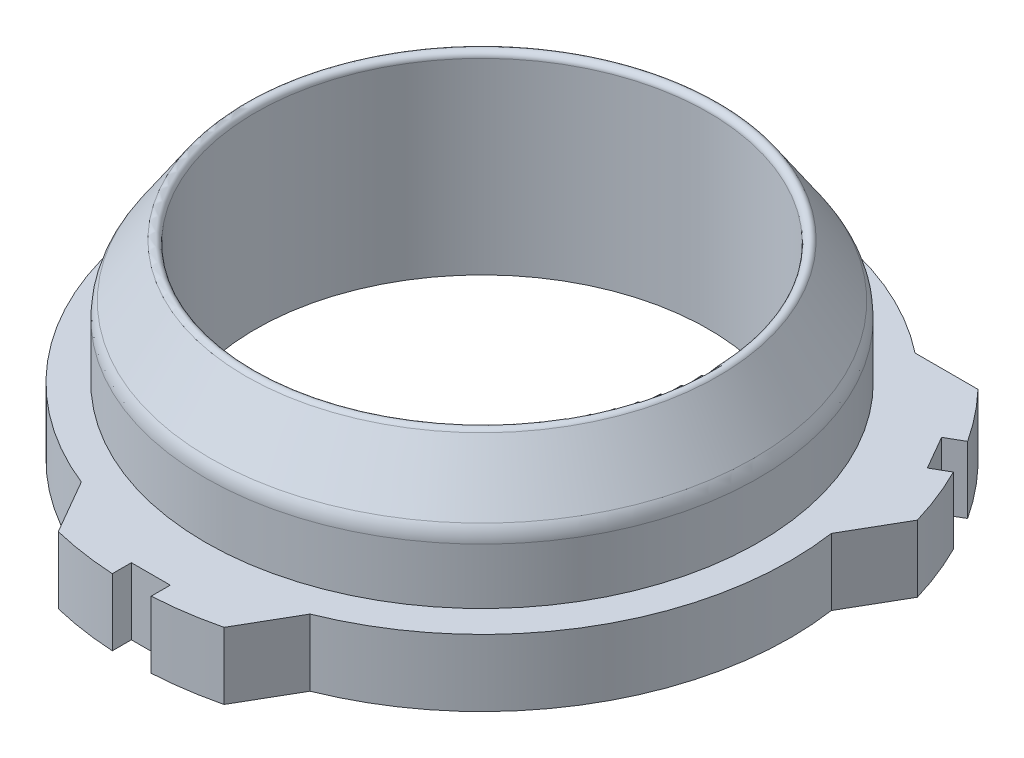
ISO-10303-21;
HEADER;
FILE_DESCRIPTION(('STEP AP214'),'2;1');
FILE_NAME('part.step','',(''),(''),'','','');
FILE_SCHEMA(('AUTOMOTIVE_DESIGN { 1 0 10303 214 1 1 1 1 }'));
ENDSEC;
DATA;
#1=APPLICATION_CONTEXT('core data for automotive mechanical design processes');
#2=APPLICATION_PROTOCOL_DEFINITION('international standard','automotive_design',2000,#1);
#3=PRODUCT_CONTEXT('',#1,'mechanical');
#4=PRODUCT('Part','Part','',(#3));
#5=PRODUCT_RELATED_PRODUCT_CATEGORY('part','',(#4));
#6=PRODUCT_DEFINITION_FORMATION('','',#4);
#7=PRODUCT_DEFINITION_CONTEXT('part definition',#1,'design');
#8=PRODUCT_DEFINITION('design','',#6,#7);
#9=PRODUCT_DEFINITION_SHAPE('','',#8);
#10=(LENGTH_UNIT() NAMED_UNIT(*) SI_UNIT(.MILLI.,.METRE.));
#11=(NAMED_UNIT(*) PLANE_ANGLE_UNIT() SI_UNIT($,.RADIAN.));
#12=(NAMED_UNIT(*) SI_UNIT($,.STERADIAN.) SOLID_ANGLE_UNIT());
#13=UNCERTAINTY_MEASURE_WITH_UNIT(LENGTH_MEASURE(1.E-05),#10,'distance_accuracy_value','');
#14=(GEOMETRIC_REPRESENTATION_CONTEXT(3) GLOBAL_UNCERTAINTY_ASSIGNED_CONTEXT((#13)) GLOBAL_UNIT_ASSIGNED_CONTEXT((#10,
#11,#12)) REPRESENTATION_CONTEXT('',''));
#15=CARTESIAN_POINT('',(0.,0.,0.));
#16=DIRECTION('',(0.,0.,1.));
#17=DIRECTION('',(1.,0.,0.));
#18=AXIS2_PLACEMENT_3D('',#15,#16,#17);
#19=CARTESIAN_POINT('',(0.,6.35,0.));
#20=DIRECTION('',(0.,1.,0.));
#21=DIRECTION('',(0.,0.,1.));
#22=AXIS2_PLACEMENT_3D('',#19,#20,#21);
#23=PLANE('',#22);
#24=CARTESIAN_POINT('',(0.,6.35,0.));
#25=DIRECTION('',(0.,1.,0.));
#26=DIRECTION('',(0.,0.,1.));
#27=AXIS2_PLACEMENT_3D('',#24,#25,#26);
#28=CIRCLE('',#27,26.289);
#29=CARTESIAN_POINT('',(0.,6.35,26.289));
#30=VERTEX_POINT('',#29);
#31=EDGE_CURVE('E348',#30,#30,#28,.T.);
#32=ORIENTED_EDGE('',*,*,#31,.F.);
#33=EDGE_LOOP('',(#32));
#34=FACE_BOUND('',#33,.T.);
#35=DIRECTION('',(0.499999999999993,0.,0.866025403784443));
#36=VECTOR('',#35,1.);
#37=CARTESIAN_POINT('',(28.1834671998819,6.35,-14.136703058055));
#38=LINE('',#37,#36);
#39=CARTESIAN_POINT('',(26.334477573974,6.35,-17.3392470327953));
#40=VERTEX_POINT('',#39);
#41=CARTESIAN_POINT('',(28.1834671998819,6.35,-14.136703058055));
#42=VERTEX_POINT('',#41);
#43=EDGE_CURVE('E208',#40,#42,#38,.T.);
#44=ORIENTED_EDGE('',*,*,#43,.F.);
#45=DIRECTION('',(-0.866025403784443,0.,0.499999999999992));
#46=VECTOR('',#45,1.);
#47=CARTESIAN_POINT('',(26.334477573974,6.35,-17.3392470327953));
#48=LINE('',#47,#46);
#49=CARTESIAN_POINT('',(27.9021874052614,6.35,-18.2443647259002));
#50=VERTEX_POINT('',#49);
#51=EDGE_CURVE('E199',#50,#40,#48,.T.);
#52=ORIENTED_EDGE('',*,*,#51,.F.);
#53=CARTESIAN_POINT('',(0.,6.35,0.));
#54=DIRECTION('',(0.,1.,0.));
#55=DIRECTION('',(0.,0.,1.));
#56=AXIS2_PLACEMENT_3D('',#53,#54,#55);
#57=CIRCLE('',#56,33.3375);
#58=CARTESIAN_POINT('',(24.1148513304045,6.35,-23.0187499999997));
#59=VERTEX_POINT('',#58);
#60=EDGE_CURVE('E372',#50,#59,#57,.T.);
#61=ORIENTED_EDGE('',*,*,#60,.T.);
#62=DIRECTION('',(-1.,0.,0.));
#63=VECTOR('',#62,1.);
#64=CARTESIAN_POINT('',(18.1345461975263,6.35,-23.0187499999997));
#65=LINE('',#64,#63);
#66=CARTESIAN_POINT('',(18.1345461975263,6.35,-23.0187499999997));
#67=VERTEX_POINT('',#66);
#68=EDGE_CURVE('E287',#59,#67,#65,.T.);
#69=ORIENTED_EDGE('',*,*,#68,.T.);
#70=CARTESIAN_POINT('',(0.,6.35,0.));
#71=DIRECTION('',(0.,1.,0.));
#72=DIRECTION('',(0.,0.,-1.));
#73=AXIS2_PLACEMENT_3D('',#70,#71,#72);
#74=CIRCLE('',#73,29.3040034355837);
#75=CARTESIAN_POINT('',(-18.1345461975263,6.35,-23.0187499999997));
#76=VERTEX_POINT('',#75);
#77=EDGE_CURVE('E290',#67,#76,#74,.T.);
#78=ORIENTED_EDGE('',*,*,#77,.T.);
#79=DIRECTION('',(-1.,0.,0.));
#80=VECTOR('',#79,1.);
#81=CARTESIAN_POINT('',(-24.1148513304039,6.35,-23.0187499999997));
#82=LINE('',#81,#80);
#83=CARTESIAN_POINT('',(-24.1148513304039,6.35,-23.0187499999997));
#84=VERTEX_POINT('',#83);
#85=EDGE_CURVE('E293',#76,#84,#82,.T.);
#86=ORIENTED_EDGE('',*,*,#85,.T.);
#87=CARTESIAN_POINT('',(-27.9021874052611,6.35,-18.2443647259006));
#88=VERTEX_POINT('',#87);
#89=EDGE_CURVE('E396',#84,#88,#57,.T.);
#90=ORIENTED_EDGE('',*,*,#89,.T.);
#91=DIRECTION('',(-0.866025403784436,0.,-0.500000000000005));
#92=VECTOR('',#91,1.);
#93=CARTESIAN_POINT('',(-26.3344775739738,6.35,-17.3392470327956));
#94=LINE('',#93,#92);
#95=CARTESIAN_POINT('',(-26.3344775739738,6.35,-17.3392470327956));
#96=VERTEX_POINT('',#95);
#97=EDGE_CURVE('E61',#96,#88,#94,.T.);
#98=ORIENTED_EDGE('',*,*,#97,.F.);
#99=DIRECTION('',(0.500000000000004,0.,-0.866025403784436));
#100=VECTOR('',#99,1.);
#101=CARTESIAN_POINT('',(-26.3344775739738,6.35,-17.3392470327956));
#102=LINE('',#101,#100);
#103=CARTESIAN_POINT('',(-28.1834671998817,6.35,-14.1367030580553));
#104=VERTEX_POINT('',#103);
#105=EDGE_CURVE('E231',#104,#96,#102,.T.);
#106=ORIENTED_EDGE('',*,*,#105,.F.);
#107=DIRECTION('',(0.866025403784436,0.,0.500000000000004));
#108=VECTOR('',#107,1.);
#109=CARTESIAN_POINT('',(-28.1834671998817,6.35,-14.1367030580553));
#110=LINE('',#109,#108);
#111=CARTESIAN_POINT('',(-29.7511770311691,6.35,-15.0418207511603));
#112=VERTEX_POINT('',#111);
#113=EDGE_CURVE('E229',#112,#104,#110,.T.);
#114=ORIENTED_EDGE('',*,*,#113,.F.);
#115=CARTESIAN_POINT('',(-31.992247928565,6.35,-9.37469886061421));
#116=VERTEX_POINT('',#115);
#117=EDGE_CURVE('E370',#112,#116,#57,.T.);
#118=ORIENTED_EDGE('',*,*,#117,.T.);
#119=DIRECTION('',(0.500000000000004,0.,0.866025403784436));
#120=VECTOR('',#119,1.);
#121=CARTESIAN_POINT('',(-29.0020953621261,6.35,-4.19560269315963));
#122=LINE('',#121,#120);
#123=CARTESIAN_POINT('',(-29.0020953621261,6.35,-4.19560269315963));
#124=VERTEX_POINT('',#123);
#125=EDGE_CURVE('E268',#116,#124,#122,.T.);
#126=ORIENTED_EDGE('',*,*,#125,.T.);
#127=CARTESIAN_POINT('',(0.,6.35,0.));
#128=DIRECTION('',(0.,1.,0.));
#129=DIRECTION('',(0.,0.,-1.));
#130=AXIS2_PLACEMENT_3D('',#127,#128,#129);
#131=CIRCLE('',#130,29.3040034355837);
#132=CARTESIAN_POINT('',(-10.8675491646001,6.35,27.2143526931599));
#133=VERTEX_POINT('',#132);
#134=EDGE_CURVE('E271',#124,#133,#131,.T.);
#135=ORIENTED_EDGE('',*,*,#134,.T.);
#136=DIRECTION('',(0.500000000000004,0.,0.866025403784436));
#137=VECTOR('',#136,1.);
#138=CARTESIAN_POINT('',(-7.87739659816125,6.35,32.3934488606145));
#139=LINE('',#138,#137);
#140=CARTESIAN_POINT('',(-7.87739659816125,6.35,32.3934488606145));
#141=VERTEX_POINT('',#140);
#142=EDGE_CURVE('E275',#133,#141,#139,.T.);
#143=ORIENTED_EDGE('',*,*,#142,.T.);
#144=CARTESIAN_POINT('',(-1.84898962590792,6.35,33.2861854770607));
#145=VERTEX_POINT('',#144);
#146=EDGE_CURVE('E367',#141,#145,#57,.T.);
#147=ORIENTED_EDGE('',*,*,#146,.T.);
#148=DIRECTION('',(0.,0.,1.));
#149=VECTOR('',#148,1.);
#150=CARTESIAN_POINT('',(-1.84898962590792,6.35,31.4759500908507));
#151=LINE('',#150,#149);
#152=CARTESIAN_POINT('',(-1.84898962590792,6.35,31.4759500908507));
#153=VERTEX_POINT('',#152);
#154=EDGE_CURVE('E252',#153,#145,#151,.T.);
#155=ORIENTED_EDGE('',*,*,#154,.F.);
#156=DIRECTION('',(-1.,0.,0.));
#157=VECTOR('',#156,1.);
#158=CARTESIAN_POINT('',(-1.84898962590792,6.35,31.4759500908507));
#159=LINE('',#158,#157);
#160=CARTESIAN_POINT('',(1.84898962590793,6.35,31.4759500908507));
#161=VERTEX_POINT('',#160);
#162=EDGE_CURVE('E249',#161,#153,#159,.T.);
#163=ORIENTED_EDGE('',*,*,#162,.F.);
#164=DIRECTION('',(0.,0.,-1.));
#165=VECTOR('',#164,1.);
#166=CARTESIAN_POINT('',(1.84898962590793,6.35,31.4759500908507));
#167=LINE('',#166,#165);
#168=CARTESIAN_POINT('',(1.84898962590793,6.35,33.2861854770607));
#169=VERTEX_POINT('',#168);
#170=EDGE_CURVE('E247',#169,#161,#167,.T.);
#171=ORIENTED_EDGE('',*,*,#170,.F.);
#172=CARTESIAN_POINT('',(7.87739659816125,6.35,32.3934488606145));
#173=VERTEX_POINT('',#172);
#174=EDGE_CURVE('E371',#169,#173,#57,.T.);
#175=ORIENTED_EDGE('',*,*,#174,.T.);
#176=DIRECTION('',(0.500000000000004,0.,-0.866025403784436));
#177=VECTOR('',#176,1.);
#178=CARTESIAN_POINT('',(10.8675491646002,6.35,27.2143526931599));
#179=LINE('',#178,#177);
#180=CARTESIAN_POINT('',(10.8675491646002,6.35,27.2143526931599));
#181=VERTEX_POINT('',#180);
#182=EDGE_CURVE('E278',#173,#181,#179,.T.);
#183=ORIENTED_EDGE('',*,*,#182,.T.);
#184=CARTESIAN_POINT('',(0.,6.35,0.));
#185=DIRECTION('',(0.,1.,0.));
#186=DIRECTION('',(0.,0.,-1.));
#187=AXIS2_PLACEMENT_3D('',#184,#185,#186);
#188=CIRCLE('',#187,29.3040034355837);
#189=CARTESIAN_POINT('',(29.0020953621261,6.35,-4.19560269315962));
#190=VERTEX_POINT('',#189);
#191=EDGE_CURVE('E281',#181,#190,#188,.T.);
#192=ORIENTED_EDGE('',*,*,#191,.T.);
#193=DIRECTION('',(0.500000000000005,0.,-0.866025403784436));
#194=VECTOR('',#193,1.);
#195=CARTESIAN_POINT('',(31.9922479285653,6.35,-9.37469886061472));
#196=LINE('',#195,#194);
#197=CARTESIAN_POINT('',(31.9922479285653,6.35,-9.37469886061472));
#198=VERTEX_POINT('',#197);
#199=EDGE_CURVE('E284',#190,#198,#196,.T.);
#200=ORIENTED_EDGE('',*,*,#199,.T.);
#201=CARTESIAN_POINT('',(29.7511770311693,6.35,-15.0418207511599));
#202=VERTEX_POINT('',#201);
#203=EDGE_CURVE('E373',#198,#202,#57,.T.);
#204=ORIENTED_EDGE('',*,*,#203,.T.);
#205=DIRECTION('',(0.866025403784444,0.,-0.499999999999992));
#206=VECTOR('',#205,1.);
#207=CARTESIAN_POINT('',(28.1834671998819,6.35,-14.136703058055));
#208=LINE('',#207,#206);
#209=EDGE_CURVE('E53',#42,#202,#208,.T.);
#210=ORIENTED_EDGE('',*,*,#209,.F.);
#211=EDGE_LOOP('',(#44,#52,#61,#69,#78,#86,#90,#98,#106,#114,#118,#126,#135,#143,#147,#155,#163,
#171,#175,#183,#192,#200,#204,#210));
#212=FACE_BOUND('',#211,.T.);
#213=ADVANCED_FACE('F38',(#34,#212),#23,.T.);
#214=CARTESIAN_POINT('',(0.,0.,0.));
#215=DIRECTION('',(0.,1.,0.));
#216=DIRECTION('',(0.,0.,1.));
#217=AXIS2_PLACEMENT_3D('',#214,#215,#216);
#218=PLANE('',#217);
#219=CARTESIAN_POINT('',(0.,0.,0.));
#220=DIRECTION('',(0.,1.,0.));
#221=DIRECTION('',(0.,0.,1.));
#222=AXIS2_PLACEMENT_3D('',#219,#220,#221);
#223=CIRCLE('',#222,21.5265);
#224=CARTESIAN_POINT('',(0.,0.,21.5265));
#225=VERTEX_POINT('',#224);
#226=EDGE_CURVE('E363',#225,#225,#223,.T.);
#227=ORIENTED_EDGE('',*,*,#226,.T.);
#228=EDGE_LOOP('',(#227));
#229=FACE_BOUND('',#228,.T.);
#230=DIRECTION('',(-0.866025403784443,0.,0.499999999999992));
#231=VECTOR('',#230,1.);
#232=CARTESIAN_POINT('',(26.334477573974,0.,-17.3392470327953));
#233=LINE('',#232,#231);
#234=CARTESIAN_POINT('',(27.9021874052614,0.,-18.2443647259002));
#235=VERTEX_POINT('',#234);
#236=CARTESIAN_POINT('',(26.334477573974,0.,-17.3392470327953));
#237=VERTEX_POINT('',#236);
#238=EDGE_CURVE('E223',#235,#237,#233,.T.);
#239=ORIENTED_EDGE('',*,*,#238,.T.);
#240=DIRECTION('',(0.499999999999993,0.,0.866025403784443));
#241=VECTOR('',#240,1.);
#242=CARTESIAN_POINT('',(28.1834671998819,0.,-14.136703058055));
#243=LINE('',#242,#241);
#244=CARTESIAN_POINT('',(28.1834671998819,0.,-14.136703058055));
#245=VERTEX_POINT('',#244);
#246=EDGE_CURVE('E214',#237,#245,#243,.T.);
#247=ORIENTED_EDGE('',*,*,#246,.T.);
#248=DIRECTION('',(0.866025403784444,0.,-0.499999999999992));
#249=VECTOR('',#248,1.);
#250=CARTESIAN_POINT('',(28.1834671998819,0.,-14.136703058055));
#251=LINE('',#250,#249);
#252=CARTESIAN_POINT('',(29.7511770311693,0.,-15.0418207511599));
#253=VERTEX_POINT('',#252);
#254=EDGE_CURVE('E209',#245,#253,#251,.T.);
#255=ORIENTED_EDGE('',*,*,#254,.T.);
#256=CARTESIAN_POINT('',(0.,0.,0.));
#257=DIRECTION('',(0.,1.,0.));
#258=DIRECTION('',(0.,0.,1.));
#259=AXIS2_PLACEMENT_3D('',#256,#257,#258);
#260=CIRCLE('',#259,33.3375);
#261=CARTESIAN_POINT('',(31.9922479285653,0.,-9.37469886061474));
#262=VERTEX_POINT('',#261);
#263=EDGE_CURVE('E379',#262,#253,#260,.T.);
#264=ORIENTED_EDGE('',*,*,#263,.F.);
#265=DIRECTION('',(0.500000000000005,0.,-0.866025403784436));
#266=VECTOR('',#265,1.);
#267=CARTESIAN_POINT('',(31.9922479285653,0.,-9.37469886061472));
#268=LINE('',#267,#266);
#269=CARTESIAN_POINT('',(29.0020953621261,0.,-4.19560269315962));
#270=VERTEX_POINT('',#269);
#271=EDGE_CURVE('E310',#270,#262,#268,.T.);
#272=ORIENTED_EDGE('',*,*,#271,.F.);
#273=CARTESIAN_POINT('',(0.,0.,0.));
#274=DIRECTION('',(0.,1.,0.));
#275=DIRECTION('',(0.,0.,-1.));
#276=AXIS2_PLACEMENT_3D('',#273,#274,#275);
#277=CIRCLE('',#276,29.3040034355837);
#278=CARTESIAN_POINT('',(10.8675491646002,0.,27.2143526931599));
#279=VERTEX_POINT('',#278);
#280=EDGE_CURVE('E307',#279,#270,#277,.T.);
#281=ORIENTED_EDGE('',*,*,#280,.F.);
#282=DIRECTION('',(0.500000000000004,0.,-0.866025403784436));
#283=VECTOR('',#282,1.);
#284=CARTESIAN_POINT('',(10.8675491646002,0.,27.2143526931599));
#285=LINE('',#284,#283);
#286=CARTESIAN_POINT('',(7.87739659816125,0.,32.3934488606145));
#287=VERTEX_POINT('',#286);
#288=EDGE_CURVE('E304',#287,#279,#285,.T.);
#289=ORIENTED_EDGE('',*,*,#288,.F.);
#290=CARTESIAN_POINT('',(1.84898962590793,0.,33.2861854770607));
#291=VERTEX_POINT('',#290);
#292=EDGE_CURVE('E366',#291,#287,#260,.T.);
#293=ORIENTED_EDGE('',*,*,#292,.F.);
#294=DIRECTION('',(0.,0.,1.));
#295=VECTOR('',#294,1.);
#296=CARTESIAN_POINT('',(1.84898962590793,0.,0.));
#297=LINE('',#296,#295);
#298=CARTESIAN_POINT('',(1.84898962590793,0.,31.4759500908507));
#299=VERTEX_POINT('',#298);
#300=EDGE_CURVE('E380',#299,#291,#297,.T.);
#301=ORIENTED_EDGE('',*,*,#300,.F.);
#302=DIRECTION('',(-1.,0.,0.));
#303=VECTOR('',#302,1.);
#304=CARTESIAN_POINT('',(-1.84898962590792,0.,31.4759500908507));
#305=LINE('',#304,#303);
#306=CARTESIAN_POINT('',(-1.84898962590792,0.,31.4759500908507));
#307=VERTEX_POINT('',#306);
#308=EDGE_CURVE('E246',#299,#307,#305,.T.);
#309=ORIENTED_EDGE('',*,*,#308,.T.);
#310=DIRECTION('',(0.,0.,1.));
#311=VECTOR('',#310,1.);
#312=CARTESIAN_POINT('',(-1.84898962590792,0.,31.4759500908507));
#313=LINE('',#312,#311);
#314=CARTESIAN_POINT('',(-1.84898962590792,0.,33.2861854770607));
#315=VERTEX_POINT('',#314);
#316=EDGE_CURVE('E250',#307,#315,#313,.T.);
#317=ORIENTED_EDGE('',*,*,#316,.T.);
#318=CARTESIAN_POINT('',(-7.87739659816094,0.,32.3934488606151));
#319=VERTEX_POINT('',#318);
#320=EDGE_CURVE('E374',#319,#315,#260,.T.);
#321=ORIENTED_EDGE('',*,*,#320,.F.);
#322=DIRECTION('',(0.500000000000004,0.,0.866025403784436));
#323=VECTOR('',#322,1.);
#324=CARTESIAN_POINT('',(-7.87739659816125,0.,32.3934488606145));
#325=LINE('',#324,#323);
#326=CARTESIAN_POINT('',(-10.8675491646001,0.,27.2143526931599));
#327=VERTEX_POINT('',#326);
#328=EDGE_CURVE('E302',#327,#319,#325,.T.);
#329=ORIENTED_EDGE('',*,*,#328,.F.);
#330=CARTESIAN_POINT('',(0.,0.,0.));
#331=DIRECTION('',(0.,1.,0.));
#332=DIRECTION('',(0.,0.,-1.));
#333=AXIS2_PLACEMENT_3D('',#330,#331,#332);
#334=CIRCLE('',#333,29.3040034355837);
#335=CARTESIAN_POINT('',(-29.0020953621261,0.,-4.19560269315963));
#336=VERTEX_POINT('',#335);
#337=EDGE_CURVE('E299',#336,#327,#334,.T.);
#338=ORIENTED_EDGE('',*,*,#337,.F.);
#339=DIRECTION('',(0.500000000000004,0.,0.866025403784436));
#340=VECTOR('',#339,1.);
#341=CARTESIAN_POINT('',(-29.0020953621261,0.,-4.19560269315963));
#342=LINE('',#341,#340);
#343=CARTESIAN_POINT('',(-31.992247928565,0.,-9.37469886061421));
#344=VERTEX_POINT('',#343);
#345=EDGE_CURVE('E267',#344,#336,#342,.T.);
#346=ORIENTED_EDGE('',*,*,#345,.F.);
#347=CARTESIAN_POINT('',(-29.7511770311691,0.,-15.0418207511603));
#348=VERTEX_POINT('',#347);
#349=EDGE_CURVE('E377',#348,#344,#260,.T.);
#350=ORIENTED_EDGE('',*,*,#349,.F.);
#351=DIRECTION('',(0.866025403784436,0.,0.500000000000004));
#352=VECTOR('',#351,1.);
#353=CARTESIAN_POINT('',(-28.1834671998817,0.,-14.1367030580553));
#354=LINE('',#353,#352);
#355=CARTESIAN_POINT('',(-28.1834671998817,0.,-14.1367030580553));
#356=VERTEX_POINT('',#355);
#357=EDGE_CURVE('E216',#348,#356,#354,.T.);
#358=ORIENTED_EDGE('',*,*,#357,.T.);
#359=DIRECTION('',(0.500000000000004,0.,-0.866025403784436));
#360=VECTOR('',#359,1.);
#361=CARTESIAN_POINT('',(-26.3344775739738,0.,-17.3392470327956));
#362=LINE('',#361,#360);
#363=CARTESIAN_POINT('',(-26.3344775739738,0.,-17.3392470327956));
#364=VERTEX_POINT('',#363);
#365=EDGE_CURVE('E238',#356,#364,#362,.T.);
#366=ORIENTED_EDGE('',*,*,#365,.T.);
#367=DIRECTION('',(-0.866025403784436,0.,-0.500000000000005));
#368=VECTOR('',#367,1.);
#369=CARTESIAN_POINT('',(-26.3344775739738,0.,-17.3392470327956));
#370=LINE('',#369,#368);
#371=CARTESIAN_POINT('',(-27.9021874052611,0.,-18.2443647259006));
#372=VERTEX_POINT('',#371);
#373=EDGE_CURVE('E232',#364,#372,#370,.T.);
#374=ORIENTED_EDGE('',*,*,#373,.T.);
#375=CARTESIAN_POINT('',(-24.1148513304045,0.,-23.0187499999997));
#376=VERTEX_POINT('',#375);
#377=EDGE_CURVE('E395',#376,#372,#260,.T.);
#378=ORIENTED_EDGE('',*,*,#377,.F.);
#379=DIRECTION('',(-1.,0.,0.));
#380=VECTOR('',#379,1.);
#381=CARTESIAN_POINT('',(-24.1148513304039,0.,-23.0187499999997));
#382=LINE('',#381,#380);
#383=CARTESIAN_POINT('',(-18.1345461975263,0.,-23.0187499999997));
#384=VERTEX_POINT('',#383);
#385=EDGE_CURVE('E272',#384,#376,#382,.T.);
#386=ORIENTED_EDGE('',*,*,#385,.F.);
#387=CARTESIAN_POINT('',(0.,0.,0.));
#388=DIRECTION('',(0.,1.,0.));
#389=DIRECTION('',(0.,0.,-1.));
#390=AXIS2_PLACEMENT_3D('',#387,#388,#389);
#391=CIRCLE('',#390,29.3040034355837);
#392=CARTESIAN_POINT('',(18.1345461975263,0.,-23.0187499999997));
#393=VERTEX_POINT('',#392);
#394=EDGE_CURVE('E315',#393,#384,#391,.T.);
#395=ORIENTED_EDGE('',*,*,#394,.F.);
#396=DIRECTION('',(-1.,0.,0.));
#397=VECTOR('',#396,1.);
#398=CARTESIAN_POINT('',(18.1345461975263,0.,-23.0187499999997));
#399=LINE('',#398,#397);
#400=CARTESIAN_POINT('',(24.1148513304045,0.,-23.0187499999997));
#401=VERTEX_POINT('',#400);
#402=EDGE_CURVE('E312',#401,#393,#399,.T.);
#403=ORIENTED_EDGE('',*,*,#402,.F.);
#404=EDGE_CURVE('E378',#235,#401,#260,.T.);
#405=ORIENTED_EDGE('',*,*,#404,.F.);
#406=EDGE_LOOP('',(#239,#247,#255,#264,#272,#281,#289,#293,#301,#309,#317,#321,#329,#338,#346,
#350,#358,#366,#374,#378,#386,#395,#403,#405));
#407=FACE_BOUND('',#406,.T.);
#408=ADVANCED_FACE('F392',(#229,#407),#218,.F.);
#409=CARTESIAN_POINT('',(0.,6.35,0.));
#410=DIRECTION('',(0.,-1.,0.));
#411=DIRECTION('',(0.,0.,-1.));
#412=AXIS2_PLACEMENT_3D('',#409,#410,#411);
#413=CYLINDRICAL_SURFACE('',#412,33.3375);
#414=DIRECTION('',(0.,-1.,0.));
#415=VECTOR('',#414,1.);
#416=CARTESIAN_POINT('',(27.9021874052614,6.35,-18.2443647259002));
#417=LINE('',#416,#415);
#418=EDGE_CURVE('E11',#235,#50,#417,.F.);
#419=ORIENTED_EDGE('',*,*,#418,.F.);
#420=ORIENTED_EDGE('',*,*,#404,.T.);
#421=DIRECTION('',(0.,-1.,0.));
#422=VECTOR('',#421,1.);
#423=CARTESIAN_POINT('',(24.1148513304045,6.35,-23.0187499999997));
#424=LINE('',#423,#422);
#425=EDGE_CURVE('E325',#59,#401,#424,.T.);
#426=ORIENTED_EDGE('',*,*,#425,.F.);
#427=ORIENTED_EDGE('',*,*,#60,.F.);
#428=EDGE_LOOP('',(#419,#420,#426,#427));
#429=FACE_BOUND('',#428,.T.);
#430=ADVANCED_FACE('F40',(#429),#413,.T.);
#431=DIRECTION('',(0.,-1.,0.));
#432=VECTOR('',#431,1.);
#433=CARTESIAN_POINT('',(29.7511770311693,6.35,-15.0418207511599));
#434=LINE('',#433,#432);
#435=EDGE_CURVE('E46',#202,#253,#434,.T.);
#436=ORIENTED_EDGE('',*,*,#435,.F.);
#437=ORIENTED_EDGE('',*,*,#203,.F.);
#438=DIRECTION('',(0.,-1.,0.));
#439=VECTOR('',#438,1.);
#440=CARTESIAN_POINT('',(31.9922479285653,6.35,-9.37469886061472));
#441=LINE('',#440,#439);
#442=EDGE_CURVE('E328',#198,#262,#441,.T.);
#443=ORIENTED_EDGE('',*,*,#442,.T.);
#444=ORIENTED_EDGE('',*,*,#263,.T.);
#445=EDGE_LOOP('',(#436,#437,#443,#444));
#446=FACE_BOUND('',#445,.T.);
#447=ADVANCED_FACE('F394',(#446),#413,.T.);
#448=DIRECTION('',(0.,-1.,0.));
#449=VECTOR('',#448,1.);
#450=CARTESIAN_POINT('',(-29.7511770311691,6.35,-15.0418207511603));
#451=LINE('',#450,#449);
#452=EDGE_CURVE('E384',#348,#112,#451,.F.);
#453=ORIENTED_EDGE('',*,*,#452,.F.);
#454=ORIENTED_EDGE('',*,*,#349,.T.);
#455=DIRECTION('',(0.,-1.,0.));
#456=VECTOR('',#455,1.);
#457=CARTESIAN_POINT('',(-31.992247928565,6.35,-9.37469886061421));
#458=LINE('',#457,#456);
#459=EDGE_CURVE('E345',#116,#344,#458,.T.);
#460=ORIENTED_EDGE('',*,*,#459,.F.);
#461=ORIENTED_EDGE('',*,*,#117,.F.);
#462=EDGE_LOOP('',(#453,#454,#460,#461));
#463=FACE_BOUND('',#462,.T.);
#464=ADVANCED_FACE('F449',(#463),#413,.T.);
#465=DIRECTION('',(0.,-1.,0.));
#466=VECTOR('',#465,1.);
#467=CARTESIAN_POINT('',(-27.9021874052611,6.35,-18.2443647259006));
#468=LINE('',#467,#466);
#469=EDGE_CURVE('E382',#88,#372,#468,.T.);
#470=ORIENTED_EDGE('',*,*,#469,.F.);
#471=ORIENTED_EDGE('',*,*,#89,.F.);
#472=DIRECTION('',(0.,-1.,0.));
#473=VECTOR('',#472,1.);
#474=CARTESIAN_POINT('',(-24.1148513304039,6.35,-23.0187499999997));
#475=LINE('',#474,#473);
#476=EDGE_CURVE('E296',#84,#376,#475,.T.);
#477=ORIENTED_EDGE('',*,*,#476,.T.);
#478=ORIENTED_EDGE('',*,*,#377,.T.);
#479=EDGE_LOOP('',(#470,#471,#477,#478));
#480=FACE_BOUND('',#479,.T.);
#481=ADVANCED_FACE('F468',(#480),#413,.T.);
#482=DIRECTION('',(0.,-1.,0.));
#483=VECTOR('',#482,1.);
#484=CARTESIAN_POINT('',(1.84898962590793,6.35,33.2861854770607));
#485=LINE('',#484,#483);
#486=EDGE_CURVE('E265',#291,#169,#485,.F.);
#487=ORIENTED_EDGE('',*,*,#486,.F.);
#488=ORIENTED_EDGE('',*,*,#292,.T.);
#489=DIRECTION('',(0.,-1.,0.));
#490=VECTOR('',#489,1.);
#491=CARTESIAN_POINT('',(7.87739659816125,6.35,32.3934488606145));
#492=LINE('',#491,#490);
#493=EDGE_CURVE('E335',#173,#287,#492,.T.);
#494=ORIENTED_EDGE('',*,*,#493,.F.);
#495=ORIENTED_EDGE('',*,*,#174,.F.);
#496=EDGE_LOOP('',(#487,#488,#494,#495));
#497=FACE_BOUND('',#496,.T.);
#498=ADVANCED_FACE('F404',(#497),#413,.T.);
#499=DIRECTION('',(0.,-1.,0.));
#500=VECTOR('',#499,1.);
#501=CARTESIAN_POINT('',(-1.84898962590792,6.35,33.2861854770607));
#502=LINE('',#501,#500);
#503=EDGE_CURVE('E263',#145,#315,#502,.T.);
#504=ORIENTED_EDGE('',*,*,#503,.F.);
#505=ORIENTED_EDGE('',*,*,#146,.F.);
#506=DIRECTION('',(0.,-1.,0.));
#507=VECTOR('',#506,1.);
#508=CARTESIAN_POINT('',(-7.87739659816125,6.35,32.3934488606145));
#509=LINE('',#508,#507);
#510=EDGE_CURVE('E338',#141,#319,#509,.T.);
#511=ORIENTED_EDGE('',*,*,#510,.T.);
#512=ORIENTED_EDGE('',*,*,#320,.T.);
#513=EDGE_LOOP('',(#504,#505,#511,#512));
#514=FACE_BOUND('',#513,.T.);
#515=ADVANCED_FACE('F431',(#514),#413,.T.);
#516=CARTESIAN_POINT('',(0.,6.35,0.));
#517=DIRECTION('',(0.,-1.,0.));
#518=DIRECTION('',(0.,0.,-1.));
#519=AXIS2_PLACEMENT_3D('',#516,#517,#518);
#520=CYLINDRICAL_SURFACE('',#519,21.5265);
#521=ORIENTED_EDGE('',*,*,#226,.F.);
#522=EDGE_LOOP('',(#521));
#523=FACE_BOUND('',#522,.T.);
#524=CARTESIAN_POINT('',(0.,17.8235795103145,0.));
#525=DIRECTION('',(0.,1.,0.));
#526=DIRECTION('',(0.,0.,1.));
#527=AXIS2_PLACEMENT_3D('',#524,#525,#526);
#528=CIRCLE('',#527,21.5265);
#529=CARTESIAN_POINT('',(0.,17.8235795103145,21.5265));
#530=VERTEX_POINT('',#529);
#531=EDGE_CURVE('E360',#530,#530,#528,.T.);
#532=ORIENTED_EDGE('',*,*,#531,.T.);
#533=EDGE_LOOP('',(#532));
#534=FACE_BOUND('',#533,.T.);
#535=ADVANCED_FACE('F493',(#523,#534),#520,.F.);
#536=CARTESIAN_POINT('',(0.,17.8235795103145,0.));
#537=DIRECTION('',(0.,1.,0.));
#538=DIRECTION('',(0.,0.,1.));
#539=AXIS2_PLACEMENT_3D('',#536,#537,#538);
#540=TOROIDAL_SURFACE('',#539,22.0345,0.508000000000003);
#541=ORIENTED_EDGE('',*,*,#531,.F.);
#542=EDGE_LOOP('',(#541));
#543=FACE_BOUND('',#542,.T.);
#544=CARTESIAN_POINT('',(0.,18.1076486317932,0.));
#545=DIRECTION('',(0.,1.,0.));
#546=DIRECTION('',(0.,0.,1.));
#547=AXIS2_PLACEMENT_3D('',#544,#545,#546);
#548=CIRCLE('',#547,22.4556516760293);
#549=CARTESIAN_POINT('',(0.,18.1076486317932,22.4556516760293));
#550=VERTEX_POINT('',#549);
#551=EDGE_CURVE('E357',#550,#550,#548,.T.);
#552=ORIENTED_EDGE('',*,*,#551,.T.);
#553=EDGE_LOOP('',(#552));
#554=FACE_BOUND('',#553,.T.);
#555=ADVANCED_FACE('F496',(#543,#554),#540,.T.);
#556=CARTESIAN_POINT('',(0.,13.0682431589662,0.));
#557=DIRECTION('',(0.,-1.,0.));
#558=DIRECTION('',(0.,0.,-1.));
#559=AXIS2_PLACEMENT_3D('',#556,#557,#558);
#560=CONICAL_SURFACE('',#559,25.8547583801464,0.593409871639138);
#561=ORIENTED_EDGE('',*,*,#551,.F.);
#562=EDGE_LOOP('',(#561));
#563=FACE_BOUND('',#562,.T.);
#564=CARTESIAN_POINT('',(0.,13.0682431589662,0.));
#565=DIRECTION('',(0.,1.,0.));
#566=DIRECTION('',(0.,0.,1.));
#567=AXIS2_PLACEMENT_3D('',#564,#565,#566);
#568=CIRCLE('',#567,25.8547583801464);
#569=CARTESIAN_POINT('',(0.,13.0682431589662,25.8547583801464));
#570=VERTEX_POINT('',#569);
#571=EDGE_CURVE('E354',#570,#570,#568,.T.);
#572=ORIENTED_EDGE('',*,*,#571,.T.);
#573=EDGE_LOOP('',(#572));
#574=FACE_BOUND('',#573,.T.);
#575=ADVANCED_FACE('F500',(#563,#574),#560,.T.);
#576=CARTESIAN_POINT('',(0.,11.6478975515723,0.));
#577=DIRECTION('',(0.,1.,0.));
#578=DIRECTION('',(0.,0.,1.));
#579=AXIS2_PLACEMENT_3D('',#576,#577,#578);
#580=TOROIDAL_SURFACE('',#579,23.749,2.54);
#581=ORIENTED_EDGE('',*,*,#571,.F.);
#582=EDGE_LOOP('',(#581));
#583=FACE_BOUND('',#582,.T.);
#584=CARTESIAN_POINT('',(0.,11.6478975515723,0.));
#585=DIRECTION('',(0.,1.,0.));
#586=DIRECTION('',(0.,0.,1.));
#587=AXIS2_PLACEMENT_3D('',#584,#585,#586);
#588=CIRCLE('',#587,26.289);
#589=CARTESIAN_POINT('',(0.,11.6478975515723,26.289));
#590=VERTEX_POINT('',#589);
#591=EDGE_CURVE('E351',#590,#590,#588,.T.);
#592=ORIENTED_EDGE('',*,*,#591,.T.);
#593=EDGE_LOOP('',(#592));
#594=FACE_BOUND('',#593,.T.);
#595=ADVANCED_FACE('F504',(#583,#594),#580,.T.);
#596=CARTESIAN_POINT('',(0.,21.2246759918043,0.));
#597=DIRECTION('',(0.,1.,0.));
#598=DIRECTION('',(0.,0.,1.));
#599=AXIS2_PLACEMENT_3D('',#596,#597,#598);
#600=CYLINDRICAL_SURFACE('',#599,26.289);
#601=ORIENTED_EDGE('',*,*,#591,.F.);
#602=EDGE_LOOP('',(#601));
#603=FACE_BOUND('',#602,.T.);
#604=ORIENTED_EDGE('',*,*,#31,.T.);
#605=EDGE_LOOP('',(#604));
#606=FACE_BOUND('',#605,.T.);
#607=ADVANCED_FACE('F508',(#603,#606),#600,.T.);
#608=CARTESIAN_POINT('',(-24.1148513304039,6.35,-23.0187499999997));
#609=DIRECTION('',(0.,0.,1.));
#610=DIRECTION('',(1.,0.,0.));
#611=AXIS2_PLACEMENT_3D('',#608,#609,#610);
#612=PLANE('',#611);
#613=ORIENTED_EDGE('',*,*,#385,.T.);
#614=ORIENTED_EDGE('',*,*,#476,.F.);
#615=ORIENTED_EDGE('',*,*,#85,.F.);
#616=DIRECTION('',(0.,-1.,0.));
#617=VECTOR('',#616,1.);
#618=CARTESIAN_POINT('',(-18.1345461975263,6.35,-23.0187499999997));
#619=LINE('',#618,#617);
#620=EDGE_CURVE('E321',#76,#384,#619,.T.);
#621=ORIENTED_EDGE('',*,*,#620,.T.);
#622=EDGE_LOOP('',(#613,#614,#615,#621));
#623=FACE_BOUND('',#622,.T.);
#624=ADVANCED_FACE('F465',(#623),#612,.F.);
#625=CARTESIAN_POINT('',(18.1345461975263,6.35,-23.0187499999997));
#626=DIRECTION('',(0.,0.,1.));
#627=DIRECTION('',(1.,0.,0.));
#628=AXIS2_PLACEMENT_3D('',#625,#626,#627);
#629=PLANE('',#628);
#630=ORIENTED_EDGE('',*,*,#402,.T.);
#631=DIRECTION('',(0.,-1.,0.));
#632=VECTOR('',#631,1.);
#633=CARTESIAN_POINT('',(18.1345461975263,6.35,-23.0187499999997));
#634=LINE('',#633,#632);
#635=EDGE_CURVE('E323',#67,#393,#634,.T.);
#636=ORIENTED_EDGE('',*,*,#635,.F.);
#637=ORIENTED_EDGE('',*,*,#68,.F.);
#638=ORIENTED_EDGE('',*,*,#425,.T.);
#639=EDGE_LOOP('',(#630,#636,#637,#638));
#640=FACE_BOUND('',#639,.T.);
#641=ADVANCED_FACE('F479',(#640),#629,.F.);
#642=CARTESIAN_POINT('',(0.,6.35,0.));
#643=DIRECTION('',(0.,-1.,0.));
#644=DIRECTION('',(0.,0.,-1.));
#645=AXIS2_PLACEMENT_3D('',#642,#643,#644);
#646=CYLINDRICAL_SURFACE('',#645,29.3040034355837);
#647=ORIENTED_EDGE('',*,*,#394,.T.);
#648=ORIENTED_EDGE('',*,*,#620,.F.);
#649=ORIENTED_EDGE('',*,*,#77,.F.);
#650=ORIENTED_EDGE('',*,*,#635,.T.);
#651=EDGE_LOOP('',(#647,#648,#649,#650));
#652=FACE_BOUND('',#651,.T.);
#653=ADVANCED_FACE('F472',(#652),#646,.T.);
#654=CARTESIAN_POINT('',(31.9922479285653,6.35,-9.37469886061472));
#655=DIRECTION('',(-0.866025403784436,0.,-0.500000000000005));
#656=DIRECTION('',(-0.500000000000005,0.,0.866025403784436));
#657=AXIS2_PLACEMENT_3D('',#654,#655,#656);
#658=PLANE('',#657);
#659=ORIENTED_EDGE('',*,*,#271,.T.);
#660=ORIENTED_EDGE('',*,*,#442,.F.);
#661=ORIENTED_EDGE('',*,*,#199,.F.);
#662=DIRECTION('',(0.,-1.,0.));
#663=VECTOR('',#662,1.);
#664=CARTESIAN_POINT('',(29.0020953621261,6.35,-4.19560269315962));
#665=LINE('',#664,#663);
#666=EDGE_CURVE('E331',#190,#270,#665,.T.);
#667=ORIENTED_EDGE('',*,*,#666,.T.);
#668=EDGE_LOOP('',(#659,#660,#661,#667));
#669=FACE_BOUND('',#668,.T.);
#670=ADVANCED_FACE('F470',(#669),#658,.F.);
#671=CARTESIAN_POINT('',(10.8675491646002,6.35,27.2143526931599));
#672=DIRECTION('',(-0.866025403784436,0.,-0.500000000000004));
#673=DIRECTION('',(-0.500000000000004,0.,0.866025403784436));
#674=AXIS2_PLACEMENT_3D('',#671,#672,#673);
#675=PLANE('',#674);
#676=ORIENTED_EDGE('',*,*,#288,.T.);
#677=DIRECTION('',(0.,-1.,0.));
#678=VECTOR('',#677,1.);
#679=CARTESIAN_POINT('',(10.8675491646002,6.35,27.2143526931599));
#680=LINE('',#679,#678);
#681=EDGE_CURVE('E333',#181,#279,#680,.T.);
#682=ORIENTED_EDGE('',*,*,#681,.F.);
#683=ORIENTED_EDGE('',*,*,#182,.F.);
#684=ORIENTED_EDGE('',*,*,#493,.T.);
#685=EDGE_LOOP('',(#676,#682,#683,#684));
#686=FACE_BOUND('',#685,.T.);
#687=ADVANCED_FACE('F410',(#686),#675,.F.);
#688=CARTESIAN_POINT('',(0.,6.35,0.));
#689=DIRECTION('',(0.,-1.,0.));
#690=DIRECTION('',(0.,0.,-1.));
#691=AXIS2_PLACEMENT_3D('',#688,#689,#690);
#692=CYLINDRICAL_SURFACE('',#691,29.3040034355837);
#693=ORIENTED_EDGE('',*,*,#280,.T.);
#694=ORIENTED_EDGE('',*,*,#666,.F.);
#695=ORIENTED_EDGE('',*,*,#191,.F.);
#696=ORIENTED_EDGE('',*,*,#681,.T.);
#697=EDGE_LOOP('',(#693,#694,#695,#696));
#698=FACE_BOUND('',#697,.T.);
#699=ADVANCED_FACE('F413',(#698),#692,.T.);
#700=CARTESIAN_POINT('',(-29.0020953621261,6.35,-4.19560269315963));
#701=DIRECTION('',(0.866025403784436,0.,-0.500000000000004));
#702=DIRECTION('',(-0.500000000000004,0.,-0.866025403784436));
#703=AXIS2_PLACEMENT_3D('',#700,#701,#702);
#704=PLANE('',#703);
#705=ORIENTED_EDGE('',*,*,#345,.T.);
#706=DIRECTION('',(0.,-1.,0.));
#707=VECTOR('',#706,1.);
#708=CARTESIAN_POINT('',(-29.0020953621261,6.35,-4.19560269315963));
#709=LINE('',#708,#707);
#710=EDGE_CURVE('E343',#124,#336,#709,.T.);
#711=ORIENTED_EDGE('',*,*,#710,.F.);
#712=ORIENTED_EDGE('',*,*,#125,.F.);
#713=ORIENTED_EDGE('',*,*,#459,.T.);
#714=EDGE_LOOP('',(#705,#711,#712,#713));
#715=FACE_BOUND('',#714,.T.);
#716=ADVANCED_FACE('F444',(#715),#704,.F.);
#717=CARTESIAN_POINT('',(0.,6.35,0.));
#718=DIRECTION('',(0.,-1.,0.));
#719=DIRECTION('',(0.,0.,-1.));
#720=AXIS2_PLACEMENT_3D('',#717,#718,#719);
#721=CYLINDRICAL_SURFACE('',#720,29.3040034355837);
#722=ORIENTED_EDGE('',*,*,#337,.T.);
#723=DIRECTION('',(0.,-1.,0.));
#724=VECTOR('',#723,1.);
#725=CARTESIAN_POINT('',(-10.8675491646001,6.35,27.2143526931599));
#726=LINE('',#725,#724);
#727=EDGE_CURVE('E341',#133,#327,#726,.T.);
#728=ORIENTED_EDGE('',*,*,#727,.F.);
#729=ORIENTED_EDGE('',*,*,#134,.F.);
#730=ORIENTED_EDGE('',*,*,#710,.T.);
#731=EDGE_LOOP('',(#722,#728,#729,#730));
#732=FACE_BOUND('',#731,.T.);
#733=ADVANCED_FACE('F439',(#732),#721,.T.);
#734=CARTESIAN_POINT('',(-7.87739659816125,6.35,32.3934488606145));
#735=DIRECTION('',(0.866025403784436,0.,-0.500000000000004));
#736=DIRECTION('',(-0.500000000000004,0.,-0.866025403784436));
#737=AXIS2_PLACEMENT_3D('',#734,#735,#736);
#738=PLANE('',#737);
#739=ORIENTED_EDGE('',*,*,#328,.T.);
#740=ORIENTED_EDGE('',*,*,#510,.F.);
#741=ORIENTED_EDGE('',*,*,#142,.F.);
#742=ORIENTED_EDGE('',*,*,#727,.T.);
#743=EDGE_LOOP('',(#739,#740,#741,#742));
#744=FACE_BOUND('',#743,.T.);
#745=ADVANCED_FACE('F435',(#744),#738,.F.);
#746=CARTESIAN_POINT('',(1.84898962590793,6.35,31.4759500908507));
#747=DIRECTION('',(-1.,0.,0.));
#748=DIRECTION('',(0.,0.,1.));
#749=AXIS2_PLACEMENT_3D('',#746,#747,#748);
#750=PLANE('',#749);
#751=ORIENTED_EDGE('',*,*,#486,.T.);
#752=ORIENTED_EDGE('',*,*,#170,.T.);
#753=DIRECTION('',(0.,-1.,0.));
#754=VECTOR('',#753,1.);
#755=CARTESIAN_POINT('',(1.84898962590793,6.35,31.4759500908507));
#756=LINE('',#755,#754);
#757=EDGE_CURVE('E260',#161,#299,#756,.T.);
#758=ORIENTED_EDGE('',*,*,#757,.T.);
#759=ORIENTED_EDGE('',*,*,#300,.T.);
#760=EDGE_LOOP('',(#751,#752,#758,#759));
#761=FACE_BOUND('',#760,.T.);
#762=ADVANCED_FACE('F421',(#761),#750,.T.);
#763=CARTESIAN_POINT('',(-1.84898962590792,6.35,31.4759500908507));
#764=DIRECTION('',(1.,0.,0.));
#765=DIRECTION('',(0.,0.,-1.));
#766=AXIS2_PLACEMENT_3D('',#763,#764,#765);
#767=PLANE('',#766);
#768=ORIENTED_EDGE('',*,*,#503,.T.);
#769=ORIENTED_EDGE('',*,*,#316,.F.);
#770=DIRECTION('',(0.,-1.,0.));
#771=VECTOR('',#770,1.);
#772=CARTESIAN_POINT('',(-1.84898962590792,6.35,31.4759500908507));
#773=LINE('',#772,#771);
#774=EDGE_CURVE('E254',#153,#307,#773,.T.);
#775=ORIENTED_EDGE('',*,*,#774,.F.);
#776=ORIENTED_EDGE('',*,*,#154,.T.);
#777=EDGE_LOOP('',(#768,#769,#775,#776));
#778=FACE_BOUND('',#777,.T.);
#779=ADVANCED_FACE('F541',(#778),#767,.T.);
#780=CARTESIAN_POINT('',(-1.84898962590792,6.35,31.4759500908507));
#781=DIRECTION('',(0.,0.,1.));
#782=DIRECTION('',(1.,0.,0.));
#783=AXIS2_PLACEMENT_3D('',#780,#781,#782);
#784=PLANE('',#783);
#785=ORIENTED_EDGE('',*,*,#308,.F.);
#786=ORIENTED_EDGE('',*,*,#757,.F.);
#787=ORIENTED_EDGE('',*,*,#162,.T.);
#788=ORIENTED_EDGE('',*,*,#774,.T.);
#789=EDGE_LOOP('',(#785,#786,#787,#788));
#790=FACE_BOUND('',#789,.T.);
#791=ADVANCED_FACE('F423',(#790),#784,.T.);
#792=CARTESIAN_POINT('',(-28.1834671998817,6.35,-14.1367030580553));
#793=DIRECTION('',(0.500000000000004,0.,-0.866025403784436));
#794=DIRECTION('',(-0.866025403784436,0.,-0.500000000000004));
#795=AXIS2_PLACEMENT_3D('',#792,#793,#794);
#796=PLANE('',#795);
#797=ORIENTED_EDGE('',*,*,#452,.T.);
#798=ORIENTED_EDGE('',*,*,#113,.T.);
#799=DIRECTION('',(0.,-1.,0.));
#800=VECTOR('',#799,1.);
#801=CARTESIAN_POINT('',(-28.1834671998817,6.35,-14.1367030580553));
#802=LINE('',#801,#800);
#803=EDGE_CURVE('E244',#104,#356,#802,.T.);
#804=ORIENTED_EDGE('',*,*,#803,.T.);
#805=ORIENTED_EDGE('',*,*,#357,.F.);
#806=EDGE_LOOP('',(#797,#798,#804,#805));
#807=FACE_BOUND('',#806,.T.);
#808=ADVANCED_FACE('F452',(#807),#796,.T.);
#809=CARTESIAN_POINT('',(-26.3344775739738,6.35,-17.3392470327956));
#810=DIRECTION('',(-0.500000000000005,0.,0.866025403784436));
#811=DIRECTION('',(0.866025403784436,0.,0.500000000000005));
#812=AXIS2_PLACEMENT_3D('',#809,#810,#811);
#813=PLANE('',#812);
#814=ORIENTED_EDGE('',*,*,#469,.T.);
#815=ORIENTED_EDGE('',*,*,#373,.F.);
#816=DIRECTION('',(0.,-1.,0.));
#817=VECTOR('',#816,1.);
#818=CARTESIAN_POINT('',(-26.3344775739738,6.35,-17.3392470327956));
#819=LINE('',#818,#817);
#820=EDGE_CURVE('E235',#96,#364,#819,.T.);
#821=ORIENTED_EDGE('',*,*,#820,.F.);
#822=ORIENTED_EDGE('',*,*,#97,.T.);
#823=EDGE_LOOP('',(#814,#815,#821,#822));
#824=FACE_BOUND('',#823,.T.);
#825=ADVANCED_FACE('F460',(#824),#813,.T.);
#826=CARTESIAN_POINT('',(-26.3344775739738,6.35,-17.3392470327956));
#827=DIRECTION('',(-0.866025403784436,0.,-0.500000000000004));
#828=DIRECTION('',(-0.500000000000004,0.,0.866025403784437));
#829=AXIS2_PLACEMENT_3D('',#826,#827,#828);
#830=PLANE('',#829);
#831=ORIENTED_EDGE('',*,*,#365,.F.);
#832=ORIENTED_EDGE('',*,*,#803,.F.);
#833=ORIENTED_EDGE('',*,*,#105,.T.);
#834=ORIENTED_EDGE('',*,*,#820,.T.);
#835=EDGE_LOOP('',(#831,#832,#833,#834));
#836=FACE_BOUND('',#835,.T.);
#837=ADVANCED_FACE('F458',(#836),#830,.T.);
#838=CARTESIAN_POINT('',(26.334477573974,6.35,-17.3392470327953));
#839=DIRECTION('',(0.499999999999992,0.,0.866025403784443));
#840=DIRECTION('',(0.866025403784443,0.,-0.499999999999992));
#841=AXIS2_PLACEMENT_3D('',#838,#839,#840);
#842=PLANE('',#841);
#843=ORIENTED_EDGE('',*,*,#418,.T.);
#844=ORIENTED_EDGE('',*,*,#51,.T.);
#845=DIRECTION('',(0.,-1.,0.));
#846=VECTOR('',#845,1.);
#847=CARTESIAN_POINT('',(26.334477573974,6.35,-17.3392470327953));
#848=LINE('',#847,#846);
#849=EDGE_CURVE('E202',#40,#237,#848,.T.);
#850=ORIENTED_EDGE('',*,*,#849,.T.);
#851=ORIENTED_EDGE('',*,*,#238,.F.);
#852=EDGE_LOOP('',(#843,#844,#850,#851));
#853=FACE_BOUND('',#852,.T.);
#854=ADVANCED_FACE('F201',(#853),#842,.T.);
#855=CARTESIAN_POINT('',(28.1834671998819,6.35,-14.136703058055));
#856=DIRECTION('',(-0.499999999999992,0.,-0.866025403784443));
#857=DIRECTION('',(-0.866025403784444,0.,0.499999999999992));
#858=AXIS2_PLACEMENT_3D('',#855,#856,#857);
#859=PLANE('',#858);
#860=ORIENTED_EDGE('',*,*,#435,.T.);
#861=ORIENTED_EDGE('',*,*,#254,.F.);
#862=DIRECTION('',(0.,-1.,0.));
#863=VECTOR('',#862,1.);
#864=CARTESIAN_POINT('',(28.1834671998819,6.35,-14.136703058055));
#865=LINE('',#864,#863);
#866=EDGE_CURVE('E217',#42,#245,#865,.T.);
#867=ORIENTED_EDGE('',*,*,#866,.F.);
#868=ORIENTED_EDGE('',*,*,#209,.T.);
#869=EDGE_LOOP('',(#860,#861,#867,#868));
#870=FACE_BOUND('',#869,.T.);
#871=ADVANCED_FACE('F386',(#870),#859,.T.);
#872=CARTESIAN_POINT('',(28.1834671998819,6.35,-14.136703058055));
#873=DIRECTION('',(0.866025403784443,0.,-0.499999999999993));
#874=DIRECTION('',(-0.499999999999993,0.,-0.866025403784443));
#875=AXIS2_PLACEMENT_3D('',#872,#873,#874);
#876=PLANE('',#875);
#877=ORIENTED_EDGE('',*,*,#246,.F.);
#878=ORIENTED_EDGE('',*,*,#849,.F.);
#879=ORIENTED_EDGE('',*,*,#43,.T.);
#880=ORIENTED_EDGE('',*,*,#866,.T.);
#881=EDGE_LOOP('',(#877,#878,#879,#880));
#882=FACE_BOUND('',#881,.T.);
#883=ADVANCED_FACE('F212',(#882),#876,.T.);
#884=CLOSED_SHELL('',(#213,#408,#430,#447,#464,#481,#498,#515,#535,#555,#575,#595,#607,#624,
#641,#653,#670,#687,#699,#716,#733,#745,#762,#779,#791,#808,#825,#837,#854,#871,#883));
#885=MANIFOLD_SOLID_BREP('B2',#884);
#886=ADVANCED_BREP_SHAPE_REPRESENTATION('',(#18,#885),#14);
#887=SHAPE_DEFINITION_REPRESENTATION(#9,#886);
ENDSEC;
END-ISO-10303-21;
